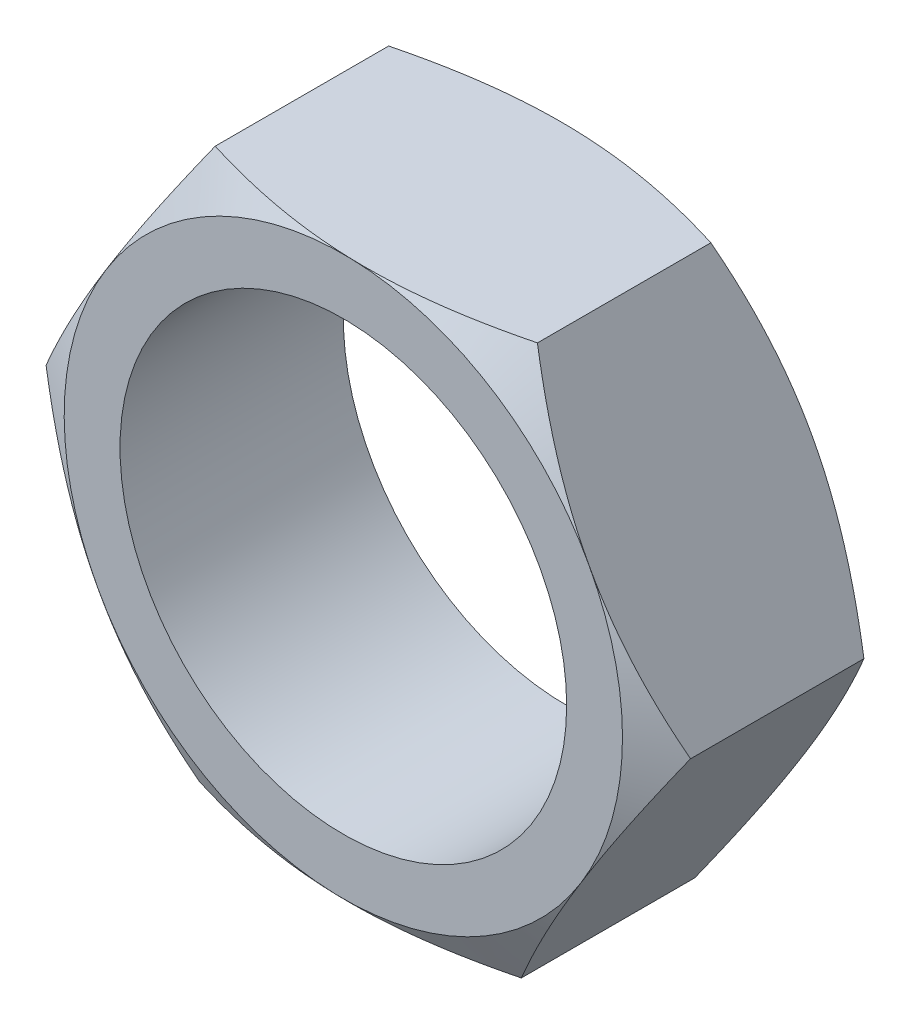
ISO-10303-21;
HEADER;
FILE_DESCRIPTION(('STEP AP214'),'2;1');
FILE_NAME('part.step','',(''),(''),'','','');
FILE_SCHEMA(('AUTOMOTIVE_DESIGN { 1 0 10303 214 1 1 1 1 }'));
ENDSEC;
DATA;
#1=APPLICATION_CONTEXT('core data for automotive mechanical design processes');
#2=APPLICATION_PROTOCOL_DEFINITION('international standard','automotive_design',2000,#1);
#3=PRODUCT_CONTEXT('',#1,'mechanical');
#4=PRODUCT('Part','Part','',(#3));
#5=PRODUCT_RELATED_PRODUCT_CATEGORY('part','',(#4));
#6=PRODUCT_DEFINITION_FORMATION('','',#4);
#7=PRODUCT_DEFINITION_CONTEXT('part definition',#1,'design');
#8=PRODUCT_DEFINITION('design','',#6,#7);
#9=PRODUCT_DEFINITION_SHAPE('','',#8);
#10=(LENGTH_UNIT() NAMED_UNIT(*) SI_UNIT(.MILLI.,.METRE.));
#11=(NAMED_UNIT(*) PLANE_ANGLE_UNIT() SI_UNIT($,.RADIAN.));
#12=(NAMED_UNIT(*) SI_UNIT($,.STERADIAN.) SOLID_ANGLE_UNIT());
#13=UNCERTAINTY_MEASURE_WITH_UNIT(LENGTH_MEASURE(1.E-05),#10,'distance_accuracy_value','');
#14=(GEOMETRIC_REPRESENTATION_CONTEXT(3) GLOBAL_UNCERTAINTY_ASSIGNED_CONTEXT((#13)) GLOBAL_UNIT_ASSIGNED_CONTEXT((#10,
#11,#12)) REPRESENTATION_CONTEXT('',''));
#15=CARTESIAN_POINT('',(0.,0.,0.));
#16=DIRECTION('',(0.,0.,1.));
#17=DIRECTION('',(1.,0.,0.));
#18=AXIS2_PLACEMENT_3D('',#15,#16,#17);
#19=CARTESIAN_POINT('',(7.21388139922552,-0.207962715988758,5.));
#20=DIRECTION('',(-0.880073847513964,-0.474836838210735,0.));
#21=DIRECTION('',(0.474836838210735,-0.880073847513964,0.));
#22=AXIS2_PLACEMENT_3D('',#19,#20,#21);
#23=PLANE('',#22);
#24=CARTESIAN_POINT('',(3.78693378629122,6.14362319362295,0.558293088260735));
#25=CARTESIAN_POINT('',(3.862259676232,6.00401240430973,0.512505690885442));
#26=CARTESIAN_POINT('',(3.93786641762387,5.86388107826209,0.468796278795684));
#27=CARTESIAN_POINT('',(4.0896939092354,5.58248040765606,0.386105746439518));
#28=CARTESIAN_POINT('',(4.16591490932345,5.44121059998565,0.34712666589515));
#29=CARTESIAN_POINT('',(4.39579830885737,5.01513926004969,0.238050014131614));
#30=CARTESIAN_POINT('',(4.5503681383499,4.72865587543348,0.176008340665018));
#31=CARTESIAN_POINT('',(4.78167907727579,4.29993870016193,0.103256954373297));
#32=CARTESIAN_POINT('',(4.85772904958887,4.15898587942229,0.0825321481755171));
#33=CARTESIAN_POINT('',(5.01017262777421,3.87644333936175,0.0477795675190953));
#34=CARTESIAN_POINT('',(5.08656620268232,3.73485367743058,0.0337512013424951));
#35=CARTESIAN_POINT('',(5.23948603526264,3.45142843618924,0.0127490178835091));
#36=CARTESIAN_POINT('',(5.31601204317241,3.3095933197947,0.00576719443978411));
#37=CARTESIAN_POINT('',(5.46913052927917,3.02579988940023,-0.000999684458703823));
#38=CARTESIAN_POINT('',(5.54572300534968,2.88384157934156,-0.000784962233976542));
#39=CARTESIAN_POINT('',(5.7555623434038,2.49492037790961,0.00969545107605987));
#40=CARTESIAN_POINT('',(5.88874051849327,2.24808479245349,0.0272900023791458));
#41=CARTESIAN_POINT('',(6.15421230869736,1.75605308595888,0.0830828811127661));
#42=CARTESIAN_POINT('',(6.28650499016571,1.51085869536251,0.121300278856705));
#43=CARTESIAN_POINT('',(6.55251105708984,1.01783674773494,0.216832842412901));
#44=CARTESIAN_POINT('',(6.68619087700224,0.770071401877181,0.274552776234462));
#45=CARTESIAN_POINT('',(6.95155695477379,0.278235625309972,0.405553798988882));
#46=CARTESIAN_POINT('',(7.08324661118652,0.0341588956407579,0.478804115636915));
#47=CARTESIAN_POINT('',(7.21398930763333,-0.208162715988757,0.558293088260735));
#48=B_SPLINE_CURVE_WITH_KNOTS('',3,(#24,#25,#26,#27,#28,#29,#30,#31,#32,#33,#34,#35,#36,#37,#38,
#39,#40,#41,#42,#43,#44,#45,#46,#47),.UNSPECIFIED.,.F.,.F.,(4,2,2,2,2,2,2,2,2,2,2,4),(0.,
0.495293497368344,0.990799812422184,1.98387144059197,2.46824501230365,2.95257577535583,
3.43635562848523,3.9201205363771,4.76230514788533,5.60526988041395,6.46693063360724,
7.32689976548183),.UNSPECIFIED.);
#49=CARTESIAN_POINT('',(3.78704169469903,6.14342319362295,0.558227484231502));
#50=VERTEX_POINT('',#49);
#51=CARTESIAN_POINT('',(5.50046154696228,2.9677302388171,0.));
#52=VERTEX_POINT('',#51);
#53=EDGE_CURVE('E126',#50,#52,#48,.T.);
#54=ORIENTED_EDGE('',*,*,#53,.F.);
#55=DIRECTION('',(0.,0.,-1.));
#56=VECTOR('',#55,1.);
#57=CARTESIAN_POINT('',(3.78704169469903,6.14342319362295,5.));
#58=LINE('',#57,#56);
#59=CARTESIAN_POINT('',(3.78704169469903,6.14342319362295,4.4417725157685));
#60=VERTEX_POINT('',#59);
#61=EDGE_CURVE('E223',#60,#50,#58,.T.);
#62=ORIENTED_EDGE('',*,*,#61,.F.);
#63=CARTESIAN_POINT('',(7.21398930763333,-0.208162715988758,4.44170691173927));
#64=CARTESIAN_POINT('',(7.13866341769255,-0.0685519266755355,4.48749430911456));
#65=CARTESIAN_POINT('',(7.06305667630068,0.0715793993721038,4.53120372120432));
#66=CARTESIAN_POINT('',(6.91122918468915,0.352980069978135,4.61389425356048));
#67=CARTESIAN_POINT('',(6.8350081846011,0.494249877648539,4.65287333410485));
#68=CARTESIAN_POINT('',(6.60512478506718,0.920321217584505,4.76194998586839));
#69=CARTESIAN_POINT('',(6.45055495557465,1.20680460220071,4.82399165933498));
#70=CARTESIAN_POINT('',(6.21924401664876,1.63552177747226,4.8967430456267));
#71=CARTESIAN_POINT('',(6.14319404433568,1.77647459821191,4.91746785182448));
#72=CARTESIAN_POINT('',(5.99075046615033,2.05901713827244,4.95222043248091));
#73=CARTESIAN_POINT('',(5.91435689124222,2.20060680020362,4.9662487986575));
#74=CARTESIAN_POINT('',(5.76143705866191,2.48403204144496,4.98725098211649));
#75=CARTESIAN_POINT('',(5.68491105075214,2.62586715783949,4.99423280556022));
#76=CARTESIAN_POINT('',(5.53179256464538,2.90966058823396,5.0009996844587));
#77=CARTESIAN_POINT('',(5.45520008857486,3.05161889829263,5.00078496223398));
#78=CARTESIAN_POINT('',(5.24536075052075,3.44054009972458,4.99030454892394));
#79=CARTESIAN_POINT('',(5.11218257543128,3.6873756851807,4.97270999762085));
#80=CARTESIAN_POINT('',(4.84671078522719,4.17940739167531,4.91691711888723));
#81=CARTESIAN_POINT('',(4.71441810375884,4.42460178227169,4.87869972114329));
#82=CARTESIAN_POINT('',(4.44841203683471,4.91762372989925,4.7831671575871));
#83=CARTESIAN_POINT('',(4.3147322169223,5.16538907575701,4.72544722376554));
#84=CARTESIAN_POINT('',(4.04936613915076,5.65722485232422,4.59444620101112));
#85=CARTESIAN_POINT('',(3.91767648273802,5.90130158199344,4.52119588436308));
#86=CARTESIAN_POINT('',(3.78693378629122,6.14362319362295,4.44170691173927));
#87=B_SPLINE_CURVE_WITH_KNOTS('',3,(#63,#64,#65,#66,#67,#68,#69,#70,#71,#72,#73,#74,#75,#76,#77,
#78,#79,#80,#81,#82,#83,#84,#85,#86),.UNSPECIFIED.,.F.,.F.,(4,2,2,2,2,2,2,2,2,2,2,4),(0.,
0.495293497368345,0.990799812422185,1.98387144059197,2.46824501230365,2.95257577535583,
3.43635562848523,3.9201205363771,4.76230514788533,5.60526988041395,6.46693063360724,
7.32689976548183),.UNSPECIFIED.);
#88=CARTESIAN_POINT('',(5.50046154696227,2.9677302388171,5.));
#89=VERTEX_POINT('',#88);
#90=EDGE_CURVE('E245',#89,#60,#87,.T.);
#91=ORIENTED_EDGE('',*,*,#90,.F.);
#92=CARTESIAN_POINT('',(7.21388139922552,-0.207962715988758,4.4417725157685));
#93=VERTEX_POINT('',#92);
#94=EDGE_CURVE('E242',#93,#89,#87,.T.);
#95=ORIENTED_EDGE('',*,*,#94,.F.);
#96=DIRECTION('',(0.,0.,-1.));
#97=VECTOR('',#96,1.);
#98=CARTESIAN_POINT('',(7.21388139922552,-0.207962715988758,5.));
#99=LINE('',#98,#97);
#100=CARTESIAN_POINT('',(7.21388139922552,-0.207962715988758,0.558227484231502));
#101=VERTEX_POINT('',#100);
#102=EDGE_CURVE('E156',#93,#101,#99,.T.);
#103=ORIENTED_EDGE('',*,*,#102,.T.);
#104=EDGE_CURVE('E138',#52,#101,#48,.T.);
#105=ORIENTED_EDGE('',*,*,#104,.F.);
#106=EDGE_LOOP('',(#54,#62,#91,#95,#103,#105));
#107=FACE_BOUND('',#106,.T.);
#108=ADVANCED_FACE('F37',(#107),#23,.F.);
#109=CARTESIAN_POINT('',(3.78704169469903,6.14342319362295,5.));
#110=DIRECTION('',(-0.028816159213804,-0.999584728258773,0.));
#111=DIRECTION('',(0.999584728258773,-0.028816159213804,0.));
#112=AXIS2_PLACEMENT_3D('',#109,#110,#111);
#113=PLANE('',#112);
#114=CARTESIAN_POINT('',(-3.42703970452648,6.35139167523786,0.558285244445088));
#115=CARTESIAN_POINT('',(-3.26847049805099,6.34682042142512,0.512498171586063));
#116=CARTESIAN_POINT('',(-3.10931006893643,6.34223212376886,0.468789091859735));
#117=CARTESIAN_POINT('',(-2.78969665810851,6.33301826658106,0.386099238659263));
#118=CARTESIAN_POINT('',(-2.62924315039652,6.32839269188596,0.347120504911875));
#119=CARTESIAN_POINT('',(-2.14531357694428,6.31444190688231,0.23804491775423));
#120=CARTESIAN_POINT('',(-1.81992728008915,6.30506162818147,0.176003980462561));
#121=CARTESIAN_POINT('',(-1.33299260916855,6.29102421183518,0.103253691121866));
#122=CARTESIAN_POINT('',(-1.17289913579122,6.28640901625694,0.082529243708354));
#123=CARTESIAN_POINT('',(-0.851988816002729,6.27715777160809,0.0477773772084499));
#124=CARTESIAN_POINT('',(-0.691172034773048,6.27252172441653,0.0337493664070603));
#125=CARTESIAN_POINT('',(-0.36925917250831,6.26324157834212,0.0127478810807782));
#126=CARTESIAN_POINT('',(-0.208163617225028,6.25859749461571,0.00576640053745188));
#127=CARTESIAN_POINT('',(0.11416740565971,6.24930529375228,-0.000999813064704883));
#128=CARTESIAN_POINT('',(0.275402868784934,6.24465717674431,-0.000784768454398575));
#129=CARTESIAN_POINT('',(0.717133873974163,6.23192289758282,0.00969640339782137));
#130=CARTESIAN_POINT('',(0.997484813036151,6.22384090406355,0.0272910854233531));
#131=CARTESIAN_POINT('',(1.55632462664075,6.20773059686439,0.0830836106996944));
#132=CARTESIAN_POINT('',(1.83481153588438,6.19970233984039,0.121300522859148));
#133=CARTESIAN_POINT('',(2.39477598073902,6.18355961162453,0.216831570760002));
#134=CARTESIAN_POINT('',(2.67618286066746,6.17544717730393,0.274550455016169));
#135=CARTESIAN_POINT('',(3.23480008869559,6.15934328683086,0.405548979830441));
#136=CARTESIAN_POINT('',(3.51201759063926,6.15135162444644,0.478797850084668));
#137=CARTESIAN_POINT('',(3.78724169469903,6.14341742799681,0.558285244445088));
#138=B_SPLINE_CURVE_WITH_KNOTS('',3,(#114,#115,#116,#117,#118,#119,#120,#121,#122,#123,#124,
#125,#126,#127,#128,#129,#130,#131,#132,#133,#134,#135,#136,#137),.UNSPECIFIED.,.F.,.F.,(4,2,2,
2,2,2,2,2,2,2,2,4),(0.,0.495292567829642,0.990797952797477,1.98386766962632,2.46824039991593,
2.95257032181306,3.43634934364185,3.9201134195202,4.76228600703233,5.60523867023901,
6.46688671550748,7.32684322956969),.UNSPECIFIED.);
#139=CARTESIAN_POINT('',(-3.42683970452648,6.35138590961171,0.558227484231503));
#140=VERTEX_POINT('',#139);
#141=CARTESIAN_POINT('',(0.180100995086275,6.24740455161733,0.));
#142=VERTEX_POINT('',#141);
#143=EDGE_CURVE('E53',#140,#142,#138,.T.);
#144=ORIENTED_EDGE('',*,*,#143,.F.);
#145=DIRECTION('',(0.,0.,-1.));
#146=VECTOR('',#145,1.);
#147=CARTESIAN_POINT('',(-3.42683970452648,6.35138590961171,5.));
#148=LINE('',#147,#146);
#149=CARTESIAN_POINT('',(-3.42683970452648,6.35138590961171,4.4417725157685));
#150=VERTEX_POINT('',#149);
#151=EDGE_CURVE('E225',#150,#140,#148,.T.);
#152=ORIENTED_EDGE('',*,*,#151,.F.);
#153=CARTESIAN_POINT('',(3.78724169469903,6.14341742799681,4.44171475555491));
#154=CARTESIAN_POINT('',(3.62867248822354,6.14798868180954,4.48750182841394));
#155=CARTESIAN_POINT('',(3.46951205910898,6.1525769794658,4.53121090814027));
#156=CARTESIAN_POINT('',(3.14989864828106,6.1617908366536,4.61390076134074));
#157=CARTESIAN_POINT('',(2.98944514056907,6.1664164113487,4.65287949508812));
#158=CARTESIAN_POINT('',(2.50551556711683,6.18036719635235,4.76195508224577));
#159=CARTESIAN_POINT('',(2.1801292702617,6.18974747505319,4.82399601953744));
#160=CARTESIAN_POINT('',(1.6931945993411,6.20378489139949,4.89674630887813));
#161=CARTESIAN_POINT('',(1.53310112596377,6.20840008697772,4.91747075629165));
#162=CARTESIAN_POINT('',(1.21219080617528,6.21765133162657,4.95222262279155));
#163=CARTESIAN_POINT('',(1.0513740249456,6.22228737881813,4.96625063359294));
#164=CARTESIAN_POINT('',(0.729461162680858,6.23156752489254,4.98725211891922));
#165=CARTESIAN_POINT('',(0.568365607397576,6.23621160861896,4.99423359946255));
#166=CARTESIAN_POINT('',(0.246034584512838,6.24550380948238,5.0009998130647));
#167=CARTESIAN_POINT('',(0.0847991213876149,6.25015192649035,5.0007847684544));
#168=CARTESIAN_POINT('',(-0.356931883801614,6.26288620565184,4.99030359660218));
#169=CARTESIAN_POINT('',(-0.637282822863603,6.27096819917111,4.97270891457665));
#170=CARTESIAN_POINT('',(-1.1961226364682,6.28707850637028,4.91691638930031));
#171=CARTESIAN_POINT('',(-1.47460954571183,6.29510676339427,4.87869947714085));
#172=CARTESIAN_POINT('',(-2.03457399056647,6.31124949161013,4.78316842924));
#173=CARTESIAN_POINT('',(-2.31598087049492,6.31936192593073,4.72544954498383));
#174=CARTESIAN_POINT('',(-2.87459809852304,6.3354658164038,4.59445102016956));
#175=CARTESIAN_POINT('',(-3.15181560046671,6.34345747878822,4.52120214991533));
#176=CARTESIAN_POINT('',(-3.42703970452648,6.35139167523786,4.44171475555491));
#177=B_SPLINE_CURVE_WITH_KNOTS('',3,(#153,#154,#155,#156,#157,#158,#159,#160,#161,#162,#163,
#164,#165,#166,#167,#168,#169,#170,#171,#172,#173,#174,#175,#176),.UNSPECIFIED.,.F.,.F.,(4,2,2,
2,2,2,2,2,2,2,2,4),(0.,0.495292567829641,0.990797952797476,1.98386766962632,2.46824039991593,
2.95257032181307,3.43634934364185,3.9201134195202,4.76228600703233,5.60523867023901,
6.46688671550748,7.32684322956969),.UNSPECIFIED.);
#178=CARTESIAN_POINT('',(0.180100995086275,6.24740455161733,5.));
#179=VERTEX_POINT('',#178);
#180=EDGE_CURVE('E252',#179,#150,#177,.T.);
#181=ORIENTED_EDGE('',*,*,#180,.F.);
#182=EDGE_CURVE('E251',#60,#179,#177,.T.);
#183=ORIENTED_EDGE('',*,*,#182,.F.);
#184=ORIENTED_EDGE('',*,*,#61,.T.);
#185=EDGE_CURVE('E132',#142,#50,#138,.T.);
#186=ORIENTED_EDGE('',*,*,#185,.F.);
#187=EDGE_LOOP('',(#144,#152,#181,#183,#184,#186));
#188=FACE_BOUND('',#187,.T.);
#189=ADVANCED_FACE('F265',(#188),#113,.F.);
#190=CARTESIAN_POINT('',(-3.42683970452648,6.35138590961171,5.));
#191=DIRECTION('',(0.85125768830016,-0.524747890048038,0.));
#192=DIRECTION('',(0.524747890048038,0.85125768830016,0.));
#193=AXIS2_PLACEMENT_3D('',#190,#191,#192);
#194=PLANE('',#193);
#195=CARTESIAN_POINT('',(-7.21400468689675,0.207762715988759,0.558295309095076));
#196=CARTESIAN_POINT('',(-7.13076110768935,0.342802300036327,0.512507819839266));
#197=CARTESIAN_POINT('',(-7.0472071560051,0.478345377212991,0.468798313647222));
#198=CARTESIAN_POINT('',(-6.87942070340342,0.750532289211283,0.386107589001232));
#199=CARTESIAN_POINT('',(-6.79518792635306,0.887176571981864,0.347128410267991));
#200=CARTESIAN_POINT('',(-6.54114091332994,1.29929728199714,0.238051457081801));
#201=CARTESIAN_POINT('',(-6.37032386391874,1.57640049548643,0.176009575181416));
#202=CARTESIAN_POINT('',(-6.11469925509532,1.99108041646665,0.103257878308989));
#203=CARTESIAN_POINT('',(-6.03065548263768,2.12741809178683,0.0825329705283015));
#204=CARTESIAN_POINT('',(-5.86218818205575,2.40070949050863,0.0477801876720673));
#205=CARTESIAN_POINT('',(-5.77776468815056,2.53766315839928,0.033751720877724));
#206=CARTESIAN_POINT('',(-5.60877106920045,2.81180836247391,0.0127493397556733));
#207=CARTESIAN_POINT('',(-5.52420122017488,2.94899945089316,0.00576741922616564));
#208=CARTESIAN_POINT('',(-5.35498806276979,3.22350079512809,-0.000999648038482705));
#209=CARTESIAN_POINT('',(-5.27034475674029,3.3608110471315,-0.000785017091201751));
#210=CARTESIAN_POINT('',(-5.03844814548451,3.73699888316865,0.0096951814492016));
#211=CARTESIAN_POINT('',(-4.8912707455727,3.97575333191448,0.0272896957387019));
#212=CARTESIAN_POINT('',(-4.59789348854574,4.45167643775823,0.0830826745446241));
#213=CARTESIAN_POINT('',(-4.45169466323375,4.68884342104212,0.121300209772195));
#214=CARTESIAN_POINT('',(-4.15772695853724,5.16572436421647,0.216833202457859));
#215=CARTESIAN_POINT('',(-4.00999517336463,5.40537814905203,0.274553433444878));
#216=CARTESIAN_POINT('',(-3.71673473312282,5.88111175211098,0.405555163446065));
#217=CARTESIAN_POINT('',(-3.5712023221981,6.11719766316664,0.478805889614524));
#218=CARTESIAN_POINT('',(-3.42671641685525,6.35158590961171,0.558295309095076));
#219=B_SPLINE_CURVE_WITH_KNOTS('',3,(#195,#196,#197,#198,#199,#200,#201,#202,#203,#204,#205,
#206,#207,#208,#209,#210,#211,#212,#213,#214,#215,#216,#217,#218),.UNSPECIFIED.,.F.,.F.,(4,2,2,
2,2,2,2,2,2,2,2,4),(0.,0.495293760550338,0.990800338941125,1.98387250827236,2.46824631821747,
2.95257731942749,3.43635740792461,3.92012255138604,4.7623105672568,5.60527871698137,
6.46694306818101,7.32691577254779),.UNSPECIFIED.);
#220=CARTESIAN_POINT('',(-7.21388139922552,0.207962715988759,0.558227484231502));
#221=VERTEX_POINT('',#220);
#222=CARTESIAN_POINT('',(-5.320360551876,3.27967431280024,0.));
#223=VERTEX_POINT('',#222);
#224=EDGE_CURVE('E60',#221,#223,#219,.T.);
#225=ORIENTED_EDGE('',*,*,#224,.F.);
#226=DIRECTION('',(0.,0.,-1.));
#227=VECTOR('',#226,1.);
#228=CARTESIAN_POINT('',(-7.21388139922552,0.207962715988759,5.));
#229=LINE('',#228,#227);
#230=CARTESIAN_POINT('',(-7.21388139922552,0.207962715988759,4.4417725157685));
#231=VERTEX_POINT('',#230);
#232=EDGE_CURVE('E228',#231,#221,#229,.T.);
#233=ORIENTED_EDGE('',*,*,#232,.F.);
#234=CARTESIAN_POINT('',(-3.42671641685525,6.35158590961171,4.44170469090492));
#235=CARTESIAN_POINT('',(-3.50995999606265,6.21654632556414,4.48749218016073));
#236=CARTESIAN_POINT('',(-3.5935139477469,6.08100324838748,4.53120168635278));
#237=CARTESIAN_POINT('',(-3.76130040034858,5.80881633638919,4.61389241099877));
#238=CARTESIAN_POINT('',(-3.84553317739894,5.67217205361861,4.65287158973201));
#239=CARTESIAN_POINT('',(-4.09958019042206,5.26005134360333,4.7619485429182));
#240=CARTESIAN_POINT('',(-4.27039723983326,4.98294813011404,4.82399042481858));
#241=CARTESIAN_POINT('',(-4.52602184865668,4.56826820913382,4.89674212169101));
#242=CARTESIAN_POINT('',(-4.61006562111432,4.43193053381364,4.9174670294717));
#243=CARTESIAN_POINT('',(-4.77853292169625,4.15863913509184,4.95221981232793));
#244=CARTESIAN_POINT('',(-4.86295641560144,4.02168546720119,4.96624827912228));
#245=CARTESIAN_POINT('',(-5.03195003455155,3.74754026312656,4.98725066024433));
#246=CARTESIAN_POINT('',(-5.11651988357712,3.61034917470731,4.99423258077383));
#247=CARTESIAN_POINT('',(-5.28573304098221,3.33584783047238,5.00099964803848));
#248=CARTESIAN_POINT('',(-5.37037634701171,3.19853757846897,5.0007850170912));
#249=CARTESIAN_POINT('',(-5.60227295826749,2.82234974243182,4.9903048185508));
#250=CARTESIAN_POINT('',(-5.7494503581793,2.58359529368599,4.9727103042613));
#251=CARTESIAN_POINT('',(-6.04282761520626,2.10767218784224,4.91691732545538));
#252=CARTESIAN_POINT('',(-6.18902644051825,1.87050520455835,4.8786997902278));
#253=CARTESIAN_POINT('',(-6.48299414521476,1.39362426138399,4.78316679754214));
#254=CARTESIAN_POINT('',(-6.63072593038736,1.15397047654844,4.72544656655512));
#255=CARTESIAN_POINT('',(-6.92398637062918,0.678236873489488,4.59444483655394));
#256=CARTESIAN_POINT('',(-7.0695187815539,0.442150962433828,4.52119411038548));
#257=CARTESIAN_POINT('',(-7.21400468689675,0.207762715988759,4.44170469090492));
#258=B_SPLINE_CURVE_WITH_KNOTS('',3,(#234,#235,#236,#237,#238,#239,#240,#241,#242,#243,#244,
#245,#246,#247,#248,#249,#250,#251,#252,#253,#254,#255,#256,#257),.UNSPECIFIED.,.F.,.F.,(4,2,2,
2,2,2,2,2,2,2,2,4),(0.,0.495293760550339,0.990800338941125,1.98387250827236,2.46824631821747,
2.95257731942749,3.43635740792461,3.92012255138604,4.7623105672568,5.60527871698138,
6.46694306818101,7.32691577254779),.UNSPECIFIED.);
#259=CARTESIAN_POINT('',(-5.320360551876,3.27967431280024,5.));
#260=VERTEX_POINT('',#259);
#261=EDGE_CURVE('E259',#260,#231,#258,.T.);
#262=ORIENTED_EDGE('',*,*,#261,.F.);
#263=EDGE_CURVE('E258',#150,#260,#258,.T.);
#264=ORIENTED_EDGE('',*,*,#263,.F.);
#265=ORIENTED_EDGE('',*,*,#151,.T.);
#266=EDGE_CURVE('E191',#223,#140,#219,.T.);
#267=ORIENTED_EDGE('',*,*,#266,.F.);
#268=EDGE_LOOP('',(#225,#233,#262,#264,#265,#267));
#269=FACE_BOUND('',#268,.T.);
#270=ADVANCED_FACE('F268',(#269),#194,.F.);
#271=CARTESIAN_POINT('',(-7.21388139922552,0.207962715988759,5.));
#272=DIRECTION('',(0.880073847513964,0.474836838210736,0.));
#273=DIRECTION('',(-0.474836838210736,0.880073847513964,0.));
#274=AXIS2_PLACEMENT_3D('',#271,#272,#273);
#275=PLANE('',#274);
#276=CARTESIAN_POINT('',(-3.78693378629122,-6.14362319362295,0.558293088260734));
#277=CARTESIAN_POINT('',(-3.862259676232,-6.00401240430973,0.51250569088544));
#278=CARTESIAN_POINT('',(-3.93786641762387,-5.86388107826209,0.468796278795683));
#279=CARTESIAN_POINT('',(-4.08969390923539,-5.58248040765606,0.386105746439517));
#280=CARTESIAN_POINT('',(-4.16591490932344,-5.44121059998566,0.34712666589515));
#281=CARTESIAN_POINT('',(-4.39579830885736,-5.01513926004969,0.238050014131613));
#282=CARTESIAN_POINT('',(-4.55036813834989,-4.72865587543348,0.176008340665016));
#283=CARTESIAN_POINT('',(-4.78167907727579,-4.29993870016194,0.103256954373296));
#284=CARTESIAN_POINT('',(-4.85772904958887,-4.15898587942229,0.0825321481755168));
#285=CARTESIAN_POINT('',(-5.01017262777421,-3.87644333936176,0.047779567519095));
#286=CARTESIAN_POINT('',(-5.08656620268232,-3.73485367743058,0.033751201342494));
#287=CARTESIAN_POINT('',(-5.23948603526264,-3.45142843618924,0.0127490178835075));
#288=CARTESIAN_POINT('',(-5.31601204317241,-3.3095933197947,0.00576719443978272));
#289=CARTESIAN_POINT('',(-5.46913052927917,-3.02579988940023,-0.000999684458704937));
#290=CARTESIAN_POINT('',(-5.54572300534968,-2.88384157934156,-0.000784962233977652));
#291=CARTESIAN_POINT('',(-5.7555623434038,-2.49492037790961,0.00969545107605872));
#292=CARTESIAN_POINT('',(-5.88874051849327,-2.2480847924535,0.0272900023791446));
#293=CARTESIAN_POINT('',(-6.15421230869736,-1.75605308595888,0.083082881112765));
#294=CARTESIAN_POINT('',(-6.28650499016571,-1.51085869536251,0.121300278856704));
#295=CARTESIAN_POINT('',(-6.55251105708983,-1.01783674773494,0.2168328424129));
#296=CARTESIAN_POINT('',(-6.68619087700224,-0.770071401877181,0.274552776234461));
#297=CARTESIAN_POINT('',(-6.95155695477379,-0.278235625309972,0.405553798988881));
#298=CARTESIAN_POINT('',(-7.08324661118652,-0.0341588956407572,0.478804115636915));
#299=CARTESIAN_POINT('',(-7.21398930763333,0.208162715988758,0.558293088260735));
#300=B_SPLINE_CURVE_WITH_KNOTS('',3,(#276,#277,#278,#279,#280,#281,#282,#283,#284,#285,#286,
#287,#288,#289,#290,#291,#292,#293,#294,#295,#296,#297,#298,#299),.UNSPECIFIED.,.F.,.F.,(4,2,2,
2,2,2,2,2,2,2,2,4),(0.,0.495293497368344,0.990799812422183,1.98387144059197,2.46824501230364,
2.95257577535583,3.43635562848523,3.9201205363771,4.76230514788533,5.60526988041395,
6.46693063360724,7.32689976548184),.UNSPECIFIED.);
#301=CARTESIAN_POINT('',(-3.78704169469903,-6.14342319362295,0.558227484231501));
#302=VERTEX_POINT('',#301);
#303=CARTESIAN_POINT('',(-5.50046154696227,-2.9677302388171,0.));
#304=VERTEX_POINT('',#303);
#305=EDGE_CURVE('E171',#302,#304,#300,.T.);
#306=ORIENTED_EDGE('',*,*,#305,.F.);
#307=DIRECTION('',(0.,0.,-1.));
#308=VECTOR('',#307,1.);
#309=CARTESIAN_POINT('',(-3.78704169469903,-6.14342319362295,5.));
#310=LINE('',#309,#308);
#311=CARTESIAN_POINT('',(-3.78704169469903,-6.14342319362295,4.4417725157685));
#312=VERTEX_POINT('',#311);
#313=EDGE_CURVE('E231',#312,#302,#310,.T.);
#314=ORIENTED_EDGE('',*,*,#313,.F.);
#315=CARTESIAN_POINT('',(-7.21398930763333,0.208162715988759,4.44170691173927));
#316=CARTESIAN_POINT('',(-7.13866341769255,0.0685519266755366,4.48749430911456));
#317=CARTESIAN_POINT('',(-7.06305667630068,-0.0715793993721025,4.53120372120432));
#318=CARTESIAN_POINT('',(-6.91122918468915,-0.352980069978134,4.61389425356048));
#319=CARTESIAN_POINT('',(-6.8350081846011,-0.494249877648538,4.65287333410485));
#320=CARTESIAN_POINT('',(-6.60512478506718,-0.920321217584503,4.76194998586839));
#321=CARTESIAN_POINT('',(-6.45055495557465,-1.20680460220071,4.82399165933498));
#322=CARTESIAN_POINT('',(-6.21924401664876,-1.63552177747226,4.8967430456267));
#323=CARTESIAN_POINT('',(-6.14319404433568,-1.77647459821191,4.91746785182448));
#324=CARTESIAN_POINT('',(-5.99075046615033,-2.05901713827244,4.95222043248091));
#325=CARTESIAN_POINT('',(-5.91435689124222,-2.20060680020361,4.96624879865751));
#326=CARTESIAN_POINT('',(-5.7614370586619,-2.48403204144495,4.98725098211649));
#327=CARTESIAN_POINT('',(-5.68491105075214,-2.62586715783949,4.99423280556022));
#328=CARTESIAN_POINT('',(-5.53179256464538,-2.90966058823396,5.00099968445871));
#329=CARTESIAN_POINT('',(-5.45520008857486,-3.05161889829263,5.00078496223398));
#330=CARTESIAN_POINT('',(-5.24536075052075,-3.44054009972458,4.99030454892394));
#331=CARTESIAN_POINT('',(-5.11218257543128,-3.6873756851807,4.97270999762086));
#332=CARTESIAN_POINT('',(-4.84671078522719,-4.17940739167531,4.91691711888723));
#333=CARTESIAN_POINT('',(-4.71441810375884,-4.42460178227169,4.8786997211433));
#334=CARTESIAN_POINT('',(-4.44841203683471,-4.91762372989925,4.7831671575871));
#335=CARTESIAN_POINT('',(-4.3147322169223,-5.16538907575701,4.72544722376554));
#336=CARTESIAN_POINT('',(-4.04936613915075,-5.65722485232422,4.59444620101112));
#337=CARTESIAN_POINT('',(-3.91767648273802,-5.90130158199344,4.52119588436308));
#338=CARTESIAN_POINT('',(-3.78693378629122,-6.14362319362295,4.44170691173927));
#339=B_SPLINE_CURVE_WITH_KNOTS('',3,(#315,#316,#317,#318,#319,#320,#321,#322,#323,#324,#325,
#326,#327,#328,#329,#330,#331,#332,#333,#334,#335,#336,#337,#338),.UNSPECIFIED.,.F.,.F.,(4,2,2,
2,2,2,2,2,2,2,2,4),(0.,0.495293497368345,0.990799812422185,1.98387144059197,2.46824501230365,
2.95257577535583,3.43635562848523,3.9201205363771,4.76230514788533,5.60526988041395,
6.46693063360725,7.32689976548184),.UNSPECIFIED.);
#340=CARTESIAN_POINT('',(-5.50046154696227,-2.9677302388171,5.));
#341=VERTEX_POINT('',#340);
#342=EDGE_CURVE('E306',#341,#312,#339,.T.);
#343=ORIENTED_EDGE('',*,*,#342,.F.);
#344=EDGE_CURVE('E311',#231,#341,#339,.T.);
#345=ORIENTED_EDGE('',*,*,#344,.F.);
#346=ORIENTED_EDGE('',*,*,#232,.T.);
#347=EDGE_CURVE('E276',#304,#221,#300,.T.);
#348=ORIENTED_EDGE('',*,*,#347,.F.);
#349=EDGE_LOOP('',(#306,#314,#343,#345,#346,#348));
#350=FACE_BOUND('',#349,.T.);
#351=ADVANCED_FACE('F318',(#350),#275,.F.);
#352=CARTESIAN_POINT('',(-3.78704169469903,-6.14342319362295,5.));
#353=DIRECTION('',(0.0288161592138037,0.999584728258773,0.));
#354=DIRECTION('',(-0.999584728258773,0.0288161592138037,0.));
#355=AXIS2_PLACEMENT_3D('',#352,#353,#354);
#356=PLANE('',#355);
#357=CARTESIAN_POINT('',(3.42703970452649,-6.35139167523785,0.558285244445088));
#358=CARTESIAN_POINT('',(3.26847049805099,-6.34682042142512,0.512498171586063));
#359=CARTESIAN_POINT('',(3.10931006893644,-6.34223212376886,0.468789091859735));
#360=CARTESIAN_POINT('',(2.78969665810851,-6.33301826658106,0.386099238659263));
#361=CARTESIAN_POINT('',(2.62924315039652,-6.32839269188596,0.347120504911875));
#362=CARTESIAN_POINT('',(2.14531357694428,-6.31444190688231,0.23804491775423));
#363=CARTESIAN_POINT('',(1.81992728008915,-6.30506162818147,0.17600398046256));
#364=CARTESIAN_POINT('',(1.33299260916855,-6.29102421183518,0.103253691121865));
#365=CARTESIAN_POINT('',(1.17289913579122,-6.28640901625694,0.0825292437083533));
#366=CARTESIAN_POINT('',(0.851988816002731,-6.27715777160809,0.0477773772084493));
#367=CARTESIAN_POINT('',(0.69117203477305,-6.27252172441653,0.0337493664070596));
#368=CARTESIAN_POINT('',(0.369259172508312,-6.26324157834212,0.0127478810807776));
#369=CARTESIAN_POINT('',(0.20816361722503,-6.25859749461571,0.0057664005374514));
#370=CARTESIAN_POINT('',(-0.114167405659708,-6.24930529375228,-0.000999813064705518));
#371=CARTESIAN_POINT('',(-0.275402868784931,-6.24465717674431,-0.000784768454399479));
#372=CARTESIAN_POINT('',(-0.71713387397416,-6.23192289758282,0.0096964033978202));
#373=CARTESIAN_POINT('',(-0.997484813036148,-6.22384090406355,0.0272910854233522));
#374=CARTESIAN_POINT('',(-1.55632462664075,-6.20773059686439,0.0830836106996936));
#375=CARTESIAN_POINT('',(-1.83481153588437,-6.19970233984039,0.121300522859147));
#376=CARTESIAN_POINT('',(-2.39477598073902,-6.18355961162453,0.216831570760001));
#377=CARTESIAN_POINT('',(-2.67618286066746,-6.17544717730393,0.274550455016168));
#378=CARTESIAN_POINT('',(-3.23480008869559,-6.15934328683086,0.40554897983044));
#379=CARTESIAN_POINT('',(-3.51201759063926,-6.15135162444644,0.478797850084667));
#380=CARTESIAN_POINT('',(-3.78724169469903,-6.14341742799681,0.558285244445087));
#381=B_SPLINE_CURVE_WITH_KNOTS('',3,(#357,#358,#359,#360,#361,#362,#363,#364,#365,#366,#367,
#368,#369,#370,#371,#372,#373,#374,#375,#376,#377,#378,#379,#380),.UNSPECIFIED.,.F.,.F.,(4,2,2,
2,2,2,2,2,2,2,2,4),(0.,0.495292567829641,0.990797952797476,1.98386766962632,2.46824039991593,
2.95257032181306,3.43634934364185,3.9201134195202,4.76228600703233,5.60523867023901,
6.46688671550748,7.32684322956969),.UNSPECIFIED.);
#382=CARTESIAN_POINT('',(3.42683970452648,-6.35138590961171,0.558227484231503));
#383=VERTEX_POINT('',#382);
#384=CARTESIAN_POINT('',(-0.180100995086273,-6.24740455161733,0.));
#385=VERTEX_POINT('',#384);
#386=EDGE_CURVE('E157',#383,#385,#381,.T.);
#387=ORIENTED_EDGE('',*,*,#386,.F.);
#388=DIRECTION('',(0.,0.,-1.));
#389=VECTOR('',#388,1.);
#390=CARTESIAN_POINT('',(3.42683970452648,-6.35138590961171,5.));
#391=LINE('',#390,#389);
#392=CARTESIAN_POINT('',(3.42683970452648,-6.35138590961171,4.4417725157685));
#393=VERTEX_POINT('',#392);
#394=EDGE_CURVE('E234',#393,#383,#391,.T.);
#395=ORIENTED_EDGE('',*,*,#394,.F.);
#396=CARTESIAN_POINT('',(-3.78724169469903,-6.14341742799681,4.44171475555491));
#397=CARTESIAN_POINT('',(-3.62867248822353,-6.14798868180954,4.48750182841394));
#398=CARTESIAN_POINT('',(-3.46951205910898,-6.1525769794658,4.53121090814027));
#399=CARTESIAN_POINT('',(-3.14989864828105,-6.1617908366536,4.61390076134074));
#400=CARTESIAN_POINT('',(-2.98944514056906,-6.1664164113487,4.65287949508813));
#401=CARTESIAN_POINT('',(-2.50551556711682,-6.18036719635235,4.76195508224577));
#402=CARTESIAN_POINT('',(-2.18012927026169,-6.18974747505319,4.82399601953744));
#403=CARTESIAN_POINT('',(-1.6931945993411,-6.20378489139948,4.89674630887813));
#404=CARTESIAN_POINT('',(-1.53310112596376,-6.20840008697772,4.91747075629165));
#405=CARTESIAN_POINT('',(-1.21219080617527,-6.21765133162657,4.95222262279155));
#406=CARTESIAN_POINT('',(-1.05137402494559,-6.22228737881813,4.96625063359294));
#407=CARTESIAN_POINT('',(-0.729461162680855,-6.23156752489254,4.98725211891922));
#408=CARTESIAN_POINT('',(-0.568365607397573,-6.23621160861895,4.99423359946255));
#409=CARTESIAN_POINT('',(-0.246034584512836,-6.24550380948238,5.0009998130647));
#410=CARTESIAN_POINT('',(-0.0847991213876119,-6.25015192649035,5.0007847684544));
#411=CARTESIAN_POINT('',(0.356931883801617,-6.26288620565184,4.99030359660218));
#412=CARTESIAN_POINT('',(0.637282822863605,-6.27096819917111,4.97270891457665));
#413=CARTESIAN_POINT('',(1.19612263646821,-6.28707850637028,4.91691638930031));
#414=CARTESIAN_POINT('',(1.47460954571183,-6.29510676339427,4.87869947714085));
#415=CARTESIAN_POINT('',(2.03457399056647,-6.31124949161013,4.78316842924));
#416=CARTESIAN_POINT('',(2.31598087049492,-6.31936192593073,4.72544954498383));
#417=CARTESIAN_POINT('',(2.87459809852304,-6.3354658164038,4.59445102016956));
#418=CARTESIAN_POINT('',(3.15181560046672,-6.34345747878822,4.52120214991533));
#419=CARTESIAN_POINT('',(3.42703970452649,-6.35139167523785,4.44171475555491));
#420=B_SPLINE_CURVE_WITH_KNOTS('',3,(#396,#397,#398,#399,#400,#401,#402,#403,#404,#405,#406,
#407,#408,#409,#410,#411,#412,#413,#414,#415,#416,#417,#418,#419),.UNSPECIFIED.,.F.,.F.,(4,2,2,
2,2,2,2,2,2,2,2,4),(0.,0.495292567829642,0.990797952797476,1.98386766962632,2.46824039991593,
2.95257032181306,3.43634934364185,3.9201134195202,4.76228600703232,5.60523867023901,
6.46688671550748,7.32684322956969),.UNSPECIFIED.);
#421=CARTESIAN_POINT('',(-0.180100995086273,-6.24740455161733,5.));
#422=VERTEX_POINT('',#421);
#423=EDGE_CURVE('E292',#422,#393,#420,.T.);
#424=ORIENTED_EDGE('',*,*,#423,.F.);
#425=EDGE_CURVE('E296',#312,#422,#420,.T.);
#426=ORIENTED_EDGE('',*,*,#425,.F.);
#427=ORIENTED_EDGE('',*,*,#313,.T.);
#428=EDGE_CURVE('E137',#385,#302,#381,.T.);
#429=ORIENTED_EDGE('',*,*,#428,.F.);
#430=EDGE_LOOP('',(#387,#395,#424,#426,#427,#429));
#431=FACE_BOUND('',#430,.T.);
#432=ADVANCED_FACE('F212',(#431),#356,.F.);
#433=CARTESIAN_POINT('',(3.42683970452648,-6.35138590961171,5.));
#434=DIRECTION('',(-0.85125768830016,0.524747890048037,0.));
#435=DIRECTION('',(-0.524747890048037,-0.85125768830016,0.));
#436=AXIS2_PLACEMENT_3D('',#433,#434,#435);
#437=PLANE('',#436);
#438=CARTESIAN_POINT('',(7.21400468689675,-0.207762715988758,0.558295309095076));
#439=CARTESIAN_POINT('',(7.13076110768935,-0.342802300036326,0.512507819839266));
#440=CARTESIAN_POINT('',(7.0472071560051,-0.478345377212989,0.468798313647222));
#441=CARTESIAN_POINT('',(6.87942070340342,-0.750532289211282,0.386107589001232));
#442=CARTESIAN_POINT('',(6.79518792635306,-0.887176571981863,0.347128410267991));
#443=CARTESIAN_POINT('',(6.54114091332994,-1.29929728199714,0.238051457081801));
#444=CARTESIAN_POINT('',(6.37032386391874,-1.57640049548643,0.176009575181416));
#445=CARTESIAN_POINT('',(6.11469925509532,-1.99108041646665,0.103257878308989));
#446=CARTESIAN_POINT('',(6.03065548263768,-2.12741809178683,0.0825329705283015));
#447=CARTESIAN_POINT('',(5.86218818205575,-2.40070949050863,0.0477801876720672));
#448=CARTESIAN_POINT('',(5.77776468815056,-2.53766315839927,0.0337517208777237));
#449=CARTESIAN_POINT('',(5.60877106920045,-2.8118083624739,0.0127493397556731));
#450=CARTESIAN_POINT('',(5.52420122017488,-2.94899945089316,0.00576741922616578));
#451=CARTESIAN_POINT('',(5.35498806276979,-3.22350079512809,-0.000999648038482326));
#452=CARTESIAN_POINT('',(5.27034475674029,-3.3608110471315,-0.000785017091201512));
#453=CARTESIAN_POINT('',(5.03844814548451,-3.73699888316865,0.00969518144920155));
#454=CARTESIAN_POINT('',(4.89127074557271,-3.97575333191448,0.0272896957387018));
#455=CARTESIAN_POINT('',(4.59789348854574,-4.45167643775823,0.083082674544624));
#456=CARTESIAN_POINT('',(4.45169466323375,-4.68884342104212,0.121300209772195));
#457=CARTESIAN_POINT('',(4.15772695853724,-5.16572436421647,0.216833202457859));
#458=CARTESIAN_POINT('',(4.00999517336464,-5.40537814905203,0.274553433444877));
#459=CARTESIAN_POINT('',(3.71673473312282,-5.88111175211098,0.405555163446065));
#460=CARTESIAN_POINT('',(3.5712023221981,-6.11719766316664,0.478805889614523));
#461=CARTESIAN_POINT('',(3.42671641685525,-6.35158590961171,0.558295309095076));
#462=B_SPLINE_CURVE_WITH_KNOTS('',3,(#438,#439,#440,#441,#442,#443,#444,#445,#446,#447,#448,
#449,#450,#451,#452,#453,#454,#455,#456,#457,#458,#459,#460,#461),.UNSPECIFIED.,.F.,.F.,(4,2,2,
2,2,2,2,2,2,2,2,4),(0.,0.495293760550339,0.990800338941125,1.98387250827236,2.46824631821747,
2.95257731942749,3.43635740792461,3.92012255138604,4.7623105672568,5.60527871698137,
6.46694306818101,7.32691577254779),.UNSPECIFIED.);
#463=CARTESIAN_POINT('',(5.320360551876,-3.27967431280023,0.));
#464=VERTEX_POINT('',#463);
#465=EDGE_CURVE('E144',#101,#464,#462,.T.);
#466=ORIENTED_EDGE('',*,*,#465,.F.);
#467=ORIENTED_EDGE('',*,*,#102,.F.);
#468=CARTESIAN_POINT('',(3.42671641685525,-6.35158590961171,4.44170469090492));
#469=CARTESIAN_POINT('',(3.50995999606266,-6.21654632556414,4.48749218016073));
#470=CARTESIAN_POINT('',(3.5935139477469,-6.08100324838748,4.53120168635278));
#471=CARTESIAN_POINT('',(3.76130040034858,-5.80881633638919,4.61389241099877));
#472=CARTESIAN_POINT('',(3.84553317739894,-5.6721720536186,4.65287158973201));
#473=CARTESIAN_POINT('',(4.09958019042206,-5.26005134360332,4.7619485429182));
#474=CARTESIAN_POINT('',(4.27039723983326,-4.98294813011404,4.82399042481858));
#475=CARTESIAN_POINT('',(4.52602184865668,-4.56826820913381,4.89674212169101));
#476=CARTESIAN_POINT('',(4.61006562111432,-4.43193053381363,4.9174670294717));
#477=CARTESIAN_POINT('',(4.77853292169625,-4.15863913509184,4.95221981232793));
#478=CARTESIAN_POINT('',(4.86295641560144,-4.02168546720119,4.96624827912228));
#479=CARTESIAN_POINT('',(5.03195003455156,-3.74754026312656,4.98725066024433));
#480=CARTESIAN_POINT('',(5.11651988357712,-3.61034917470731,4.99423258077383));
#481=CARTESIAN_POINT('',(5.28573304098221,-3.33584783047238,5.00099964803848));
#482=CARTESIAN_POINT('',(5.37037634701171,-3.19853757846897,5.0007850170912));
#483=CARTESIAN_POINT('',(5.60227295826749,-2.82234974243181,4.9903048185508));
#484=CARTESIAN_POINT('',(5.7494503581793,-2.58359529368599,4.9727103042613));
#485=CARTESIAN_POINT('',(6.04282761520626,-2.10767218784224,4.91691732545538));
#486=CARTESIAN_POINT('',(6.18902644051825,-1.87050520455835,4.8786997902278));
#487=CARTESIAN_POINT('',(6.48299414521476,-1.39362426138399,4.78316679754214));
#488=CARTESIAN_POINT('',(6.63072593038737,-1.15397047654844,4.72544656655512));
#489=CARTESIAN_POINT('',(6.92398637062918,-0.678236873489487,4.59444483655393));
#490=CARTESIAN_POINT('',(7.0695187815539,-0.442150962433828,4.52119411038548));
#491=CARTESIAN_POINT('',(7.21400468689675,-0.207762715988758,4.44170469090492));
#492=B_SPLINE_CURVE_WITH_KNOTS('',3,(#468,#469,#470,#471,#472,#473,#474,#475,#476,#477,#478,
#479,#480,#481,#482,#483,#484,#485,#486,#487,#488,#489,#490,#491),.UNSPECIFIED.,.F.,.F.,(4,2,2,
2,2,2,2,2,2,2,2,4),(0.,0.495293760550339,0.990800338941125,1.98387250827236,2.46824631821747,
2.95257731942749,3.43635740792461,3.92012255138604,4.7623105672568,5.60527871698137,
6.46694306818101,7.32691577254779),.UNSPECIFIED.);
#493=CARTESIAN_POINT('',(5.320360551876,-3.27967431280023,5.));
#494=VERTEX_POINT('',#493);
#495=EDGE_CURVE('E217',#494,#93,#492,.T.);
#496=ORIENTED_EDGE('',*,*,#495,.F.);
#497=EDGE_CURVE('E149',#393,#494,#492,.T.);
#498=ORIENTED_EDGE('',*,*,#497,.F.);
#499=ORIENTED_EDGE('',*,*,#394,.T.);
#500=EDGE_CURVE('E200',#464,#383,#462,.T.);
#501=ORIENTED_EDGE('',*,*,#500,.F.);
#502=EDGE_LOOP('',(#466,#467,#496,#498,#499,#501));
#503=FACE_BOUND('',#502,.T.);
#504=ADVANCED_FACE('F208',(#503),#437,.F.);
#505=CARTESIAN_POINT('',(0.,0.,0.));
#506=DIRECTION('',(0.,0.,1.));
#507=DIRECTION('',(1.,0.,0.));
#508=AXIS2_PLACEMENT_3D('',#505,#506,#507);
#509=PLANE('',#508);
#510=CARTESIAN_POINT('',(0.,0.,0.));
#511=DIRECTION('',(0.,0.,1.));
#512=DIRECTION('',(1.,0.,0.));
#513=AXIS2_PLACEMENT_3D('',#510,#511,#512);
#514=CIRCLE('',#513,5.);
#515=CARTESIAN_POINT('',(5.,0.,0.));
#516=VERTEX_POINT('',#515);
#517=EDGE_CURVE('E239',#516,#516,#514,.T.);
#518=ORIENTED_EDGE('',*,*,#517,.T.);
#519=EDGE_LOOP('',(#518));
#520=FACE_BOUND('',#519,.T.);
#521=CARTESIAN_POINT('',(0.,0.,0.));
#522=DIRECTION('',(0.,0.,1.));
#523=DIRECTION('',(1.,0.,0.));
#524=AXIS2_PLACEMENT_3D('',#521,#522,#523);
#525=CIRCLE('',#524,6.25);
#526=EDGE_CURVE('E12',#52,#142,#525,.T.);
#527=ORIENTED_EDGE('',*,*,#526,.F.);
#528=EDGE_CURVE('E41',#464,#52,#525,.T.);
#529=ORIENTED_EDGE('',*,*,#528,.F.);
#530=EDGE_CURVE('E148',#385,#464,#525,.T.);
#531=ORIENTED_EDGE('',*,*,#530,.F.);
#532=EDGE_CURVE('E427',#304,#385,#525,.T.);
#533=ORIENTED_EDGE('',*,*,#532,.F.);
#534=EDGE_CURVE('E46',#223,#304,#525,.T.);
#535=ORIENTED_EDGE('',*,*,#534,.F.);
#536=CARTESIAN_POINT('',(0.,0.,0.));
#537=DIRECTION('',(0.,0.,-1.));
#538=DIRECTION('',(-1.,0.,0.));
#539=AXIS2_PLACEMENT_3D('',#536,#537,#538);
#540=CIRCLE('',#539,6.25);
#541=EDGE_CURVE('E152',#223,#142,#540,.T.);
#542=ORIENTED_EDGE('',*,*,#541,.T.);
#543=EDGE_LOOP('',(#527,#529,#531,#533,#535,#542));
#544=FACE_BOUND('',#543,.T.);
#545=ADVANCED_FACE('F150',(#520,#544),#509,.F.);
#546=CARTESIAN_POINT('',(0.,0.,5.));
#547=DIRECTION('',(0.,0.,1.));
#548=DIRECTION('',(1.,0.,0.));
#549=AXIS2_PLACEMENT_3D('',#546,#547,#548);
#550=PLANE('',#549);
#551=CARTESIAN_POINT('',(0.,0.,5.));
#552=DIRECTION('',(0.,0.,1.));
#553=DIRECTION('',(1.,0.,0.));
#554=AXIS2_PLACEMENT_3D('',#551,#552,#553);
#555=CIRCLE('',#554,5.);
#556=CARTESIAN_POINT('',(5.,0.,5.));
#557=VERTEX_POINT('',#556);
#558=EDGE_CURVE('E238',#557,#557,#555,.T.);
#559=ORIENTED_EDGE('',*,*,#558,.F.);
#560=EDGE_LOOP('',(#559));
#561=FACE_BOUND('',#560,.T.);
#562=CARTESIAN_POINT('',(0.,0.,5.));
#563=DIRECTION('',(0.,0.,1.));
#564=DIRECTION('',(1.,0.,0.));
#565=AXIS2_PLACEMENT_3D('',#562,#563,#564);
#566=CIRCLE('',#565,6.25);
#567=EDGE_CURVE('E282',#494,#89,#566,.T.);
#568=ORIENTED_EDGE('',*,*,#567,.T.);
#569=EDGE_CURVE('E285',#89,#179,#566,.T.);
#570=ORIENTED_EDGE('',*,*,#569,.T.);
#571=EDGE_CURVE('E293',#179,#260,#566,.T.);
#572=ORIENTED_EDGE('',*,*,#571,.T.);
#573=EDGE_CURVE('E297',#260,#341,#566,.T.);
#574=ORIENTED_EDGE('',*,*,#573,.T.);
#575=EDGE_CURVE('E290',#341,#422,#566,.T.);
#576=ORIENTED_EDGE('',*,*,#575,.T.);
#577=EDGE_CURVE('E284',#422,#494,#566,.T.);
#578=ORIENTED_EDGE('',*,*,#577,.T.);
#579=EDGE_LOOP('',(#568,#570,#572,#574,#576,#578));
#580=FACE_BOUND('',#579,.T.);
#581=ADVANCED_FACE('F300',(#561,#580),#550,.T.);
#582=CARTESIAN_POINT('',(0.,0.,5.));
#583=DIRECTION('',(0.,0.,-1.));
#584=DIRECTION('',(-1.,0.,0.));
#585=AXIS2_PLACEMENT_3D('',#582,#583,#584);
#586=CYLINDRICAL_SURFACE('',#585,5.);
#587=ORIENTED_EDGE('',*,*,#558,.T.);
#588=EDGE_LOOP('',(#587));
#589=FACE_BOUND('',#588,.T.);
#590=ORIENTED_EDGE('',*,*,#517,.F.);
#591=EDGE_LOOP('',(#590));
#592=FACE_BOUND('',#591,.T.);
#593=ADVANCED_FACE('F455',(#589,#592),#586,.F.);
#594=CARTESIAN_POINT('',(0.,0.,5.));
#595=DIRECTION('',(0.,0.,-1.));
#596=DIRECTION('',(1.,0.,0.));
#597=AXIS2_PLACEMENT_3D('',#594,#595,#596);
#598=CONICAL_SURFACE('',#597,6.25,1.0471975511966);
#599=ORIENTED_EDGE('',*,*,#94,.T.);
#600=ORIENTED_EDGE('',*,*,#567,.F.);
#601=ORIENTED_EDGE('',*,*,#495,.T.);
#602=EDGE_LOOP('',(#599,#600,#601));
#603=FACE_BOUND('',#602,.T.);
#604=ADVANCED_FACE('F185',(#603),#598,.T.);
#605=ORIENTED_EDGE('',*,*,#423,.T.);
#606=ORIENTED_EDGE('',*,*,#497,.T.);
#607=ORIENTED_EDGE('',*,*,#577,.F.);
#608=EDGE_LOOP('',(#605,#606,#607));
#609=FACE_BOUND('',#608,.T.);
#610=ADVANCED_FACE('F430',(#609),#598,.T.);
#611=ORIENTED_EDGE('',*,*,#342,.T.);
#612=ORIENTED_EDGE('',*,*,#425,.T.);
#613=ORIENTED_EDGE('',*,*,#575,.F.);
#614=EDGE_LOOP('',(#611,#612,#613));
#615=FACE_BOUND('',#614,.T.);
#616=ADVANCED_FACE('F304',(#615),#598,.T.);
#617=ORIENTED_EDGE('',*,*,#261,.T.);
#618=ORIENTED_EDGE('',*,*,#344,.T.);
#619=ORIENTED_EDGE('',*,*,#573,.F.);
#620=EDGE_LOOP('',(#617,#618,#619));
#621=FACE_BOUND('',#620,.T.);
#622=ADVANCED_FACE('F312',(#621),#598,.T.);
#623=ORIENTED_EDGE('',*,*,#180,.T.);
#624=ORIENTED_EDGE('',*,*,#263,.T.);
#625=ORIENTED_EDGE('',*,*,#571,.F.);
#626=EDGE_LOOP('',(#623,#624,#625));
#627=FACE_BOUND('',#626,.T.);
#628=ADVANCED_FACE('F441',(#627),#598,.T.);
#629=ORIENTED_EDGE('',*,*,#90,.T.);
#630=ORIENTED_EDGE('',*,*,#182,.T.);
#631=ORIENTED_EDGE('',*,*,#569,.F.);
#632=EDGE_LOOP('',(#629,#630,#631));
#633=FACE_BOUND('',#632,.T.);
#634=ADVANCED_FACE('F383',(#633),#598,.T.);
#635=CARTESIAN_POINT('',(0.,0.,0.));
#636=DIRECTION('',(0.,0.,1.));
#637=DIRECTION('',(-1.,0.,0.));
#638=AXIS2_PLACEMENT_3D('',#635,#636,#637);
#639=CONICAL_SURFACE('',#638,6.25,1.0471975511966);
#640=ORIENTED_EDGE('',*,*,#104,.T.);
#641=ORIENTED_EDGE('',*,*,#465,.T.);
#642=ORIENTED_EDGE('',*,*,#528,.T.);
#643=EDGE_LOOP('',(#640,#641,#642));
#644=FACE_BOUND('',#643,.T.);
#645=ADVANCED_FACE('F142',(#644),#639,.T.);
#646=ORIENTED_EDGE('',*,*,#386,.T.);
#647=ORIENTED_EDGE('',*,*,#530,.T.);
#648=ORIENTED_EDGE('',*,*,#500,.T.);
#649=EDGE_LOOP('',(#646,#647,#648));
#650=FACE_BOUND('',#649,.T.);
#651=ADVANCED_FACE('F184',(#650),#639,.T.);
#652=ORIENTED_EDGE('',*,*,#305,.T.);
#653=ORIENTED_EDGE('',*,*,#532,.T.);
#654=ORIENTED_EDGE('',*,*,#428,.T.);
#655=EDGE_LOOP('',(#652,#653,#654));
#656=FACE_BOUND('',#655,.T.);
#657=ADVANCED_FACE('F183',(#656),#639,.T.);
#658=ORIENTED_EDGE('',*,*,#224,.T.);
#659=ORIENTED_EDGE('',*,*,#534,.T.);
#660=ORIENTED_EDGE('',*,*,#347,.T.);
#661=EDGE_LOOP('',(#658,#659,#660));
#662=FACE_BOUND('',#661,.T.);
#663=ADVANCED_FACE('F178',(#662),#639,.T.);
#664=ORIENTED_EDGE('',*,*,#266,.T.);
#665=ORIENTED_EDGE('',*,*,#143,.T.);
#666=ORIENTED_EDGE('',*,*,#541,.F.);
#667=EDGE_LOOP('',(#664,#665,#666));
#668=FACE_BOUND('',#667,.T.);
#669=ADVANCED_FACE('F182',(#668),#639,.T.);
#670=ORIENTED_EDGE('',*,*,#185,.T.);
#671=ORIENTED_EDGE('',*,*,#53,.T.);
#672=ORIENTED_EDGE('',*,*,#526,.T.);
#673=EDGE_LOOP('',(#670,#671,#672));
#674=FACE_BOUND('',#673,.T.);
#675=ADVANCED_FACE('F128',(#674),#639,.T.);
#676=CLOSED_SHELL('',(#108,#189,#270,#351,#432,#504,#545,#581,#593,#604,#610,#616,#622,#628,
#634,#645,#651,#657,#663,#669,#675));
#677=MANIFOLD_SOLID_BREP('B2',#676);
#678=ADVANCED_BREP_SHAPE_REPRESENTATION('',(#18,#677),#14);
#679=SHAPE_DEFINITION_REPRESENTATION(#9,#678);
ENDSEC;
END-ISO-10303-21;
